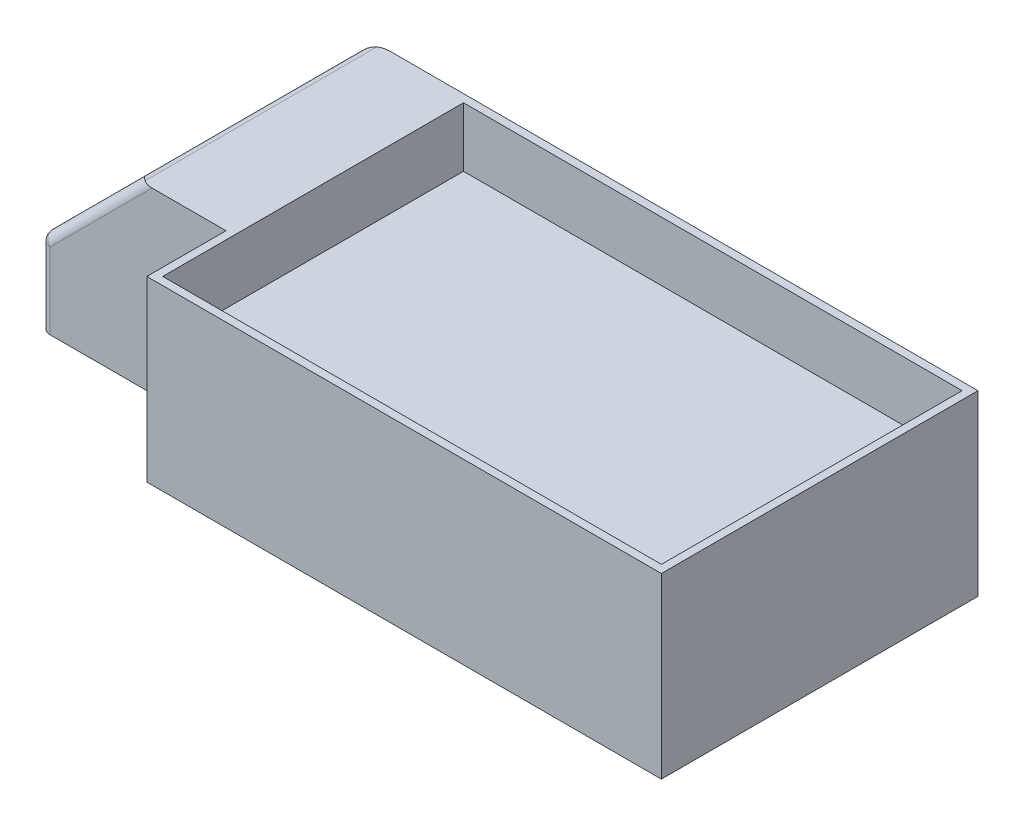
ISO-10303-21;
HEADER;
FILE_DESCRIPTION(('STEP AP214'),'2;1');
FILE_NAME('part.step','',(''),(''),'','','');
FILE_SCHEMA(('AUTOMOTIVE_DESIGN { 1 0 10303 214 1 1 1 1 }'));
ENDSEC;
DATA;
#1=APPLICATION_CONTEXT('core data for automotive mechanical design processes');
#2=APPLICATION_PROTOCOL_DEFINITION('international standard','automotive_design',2000,#1);
#3=PRODUCT_CONTEXT('',#1,'mechanical');
#4=PRODUCT('Part','Part','',(#3));
#5=PRODUCT_RELATED_PRODUCT_CATEGORY('part','',(#4));
#6=PRODUCT_DEFINITION_FORMATION('','',#4);
#7=PRODUCT_DEFINITION_CONTEXT('part definition',#1,'design');
#8=PRODUCT_DEFINITION('design','',#6,#7);
#9=PRODUCT_DEFINITION_SHAPE('','',#8);
#10=(LENGTH_UNIT() NAMED_UNIT(*) SI_UNIT(.MILLI.,.METRE.));
#11=(NAMED_UNIT(*) PLANE_ANGLE_UNIT() SI_UNIT($,.RADIAN.));
#12=(NAMED_UNIT(*) SI_UNIT($,.STERADIAN.) SOLID_ANGLE_UNIT());
#13=UNCERTAINTY_MEASURE_WITH_UNIT(LENGTH_MEASURE(1.E-05),#10,'distance_accuracy_value','');
#14=(GEOMETRIC_REPRESENTATION_CONTEXT(3) GLOBAL_UNCERTAINTY_ASSIGNED_CONTEXT((#13)) GLOBAL_UNIT_ASSIGNED_CONTEXT((#10,
#11,#12)) REPRESENTATION_CONTEXT('',''));
#15=CARTESIAN_POINT('',(0.,0.,0.));
#16=DIRECTION('',(0.,0.,1.));
#17=DIRECTION('',(1.,0.,0.));
#18=AXIS2_PLACEMENT_3D('',#15,#16,#17);
#19=CARTESIAN_POINT('',(0.,45.,0.));
#20=DIRECTION('',(0.,-1.,0.));
#21=DIRECTION('',(0.,0.,-1.));
#22=AXIS2_PLACEMENT_3D('',#19,#20,#21);
#23=PLANE('',#22);
#24=DIRECTION('',(0.,0.,-1.));
#25=VECTOR('',#24,1.);
#26=CARTESIAN_POINT('',(130.,45.,0.));
#27=LINE('',#26,#25);
#28=CARTESIAN_POINT('',(130.,45.,0.));
#29=VERTEX_POINT('',#28);
#30=CARTESIAN_POINT('',(130.,45.,-80.));
#31=VERTEX_POINT('',#30);
#32=EDGE_CURVE('E433',#29,#31,#27,.T.);
#33=ORIENTED_EDGE('',*,*,#32,.T.);
#34=DIRECTION('',(1.,0.,0.));
#35=VECTOR('',#34,1.);
#36=CARTESIAN_POINT('',(0.,45.,-80.));
#37=LINE('',#36,#35);
#38=CARTESIAN_POINT('',(-18.6671491507452,45.,-80.));
#39=VERTEX_POINT('',#38);
#40=EDGE_CURVE('E430',#39,#31,#37,.T.);
#41=ORIENTED_EDGE('',*,*,#40,.F.);
#42=CARTESIAN_POINT('',(-18.6671491507452,45.,-77.5));
#43=DIRECTION('',(0.,-1.,0.));
#44=DIRECTION('',(-1.,0.,0.));
#45=AXIS2_PLACEMENT_3D('',#42,#43,#44);
#46=ELLIPSE('',#45,3.53553390593274,2.5);
#47=CARTESIAN_POINT('',(-21.1671491507452,45.,-79.2677669529664));
#48=VERTEX_POINT('',#47);
#49=EDGE_CURVE('E492',#39,#48,#46,.F.);
#50=ORIENTED_EDGE('',*,*,#49,.T.);
#51=DIRECTION('',(0.,0.,1.));
#52=VECTOR('',#51,1.);
#53=CARTESIAN_POINT('',(-21.1671491507452,45.,0.));
#54=LINE('',#53,#52);
#55=CARTESIAN_POINT('',(-21.1671491507452,45.,-20.7322330470336));
#56=VERTEX_POINT('',#55);
#57=EDGE_CURVE('E489',#48,#56,#54,.T.);
#58=ORIENTED_EDGE('',*,*,#57,.T.);
#59=CARTESIAN_POINT('',(-18.6671491507452,45.,-22.5));
#60=DIRECTION('',(0.,-1.,0.));
#61=DIRECTION('',(1.,0.,0.));
#62=AXIS2_PLACEMENT_3D('',#59,#60,#61);
#63=ELLIPSE('',#62,3.53553390593274,2.5);
#64=CARTESIAN_POINT('',(-18.6671491507452,45.,-20.));
#65=VERTEX_POINT('',#64);
#66=EDGE_CURVE('E486',#56,#65,#63,.F.);
#67=ORIENTED_EDGE('',*,*,#66,.T.);
#68=DIRECTION('',(-1.,0.,0.));
#69=VECTOR('',#68,1.);
#70=CARTESIAN_POINT('',(-22.2026830566779,45.,-20.));
#71=LINE('',#70,#69);
#72=CARTESIAN_POINT('',(0.,45.,-20.));
#73=VERTEX_POINT('',#72);
#74=EDGE_CURVE('E411',#73,#65,#71,.T.);
#75=ORIENTED_EDGE('',*,*,#74,.F.);
#76=DIRECTION('',(0.,0.,1.));
#77=VECTOR('',#76,1.);
#78=CARTESIAN_POINT('',(0.,45.,-20.));
#79=LINE('',#78,#77);
#80=CARTESIAN_POINT('',(0.,45.,0.));
#81=VERTEX_POINT('',#80);
#82=EDGE_CURVE('E419',#73,#81,#79,.T.);
#83=ORIENTED_EDGE('',*,*,#82,.T.);
#84=DIRECTION('',(1.,0.,0.));
#85=VECTOR('',#84,1.);
#86=CARTESIAN_POINT('',(0.,45.,0.));
#87=LINE('',#86,#85);
#88=EDGE_CURVE('E438',#81,#29,#87,.T.);
#89=ORIENTED_EDGE('',*,*,#88,.T.);
#90=EDGE_LOOP('',(#33,#41,#50,#58,#67,#75,#83,#89));
#91=FACE_BOUND('',#90,.T.);
#92=DIRECTION('',(-1.,0.,0.));
#93=VECTOR('',#92,1.);
#94=CARTESIAN_POINT('',(0.,45.,-2.));
#95=LINE('',#94,#93);
#96=CARTESIAN_POINT('',(128.,45.,-2.));
#97=VERTEX_POINT('',#96);
#98=CARTESIAN_POINT('',(2.,45.,-2.));
#99=VERTEX_POINT('',#98);
#100=EDGE_CURVE('E263',#97,#99,#95,.T.);
#101=ORIENTED_EDGE('',*,*,#100,.T.);
#102=DIRECTION('',(0.,0.,-1.));
#103=VECTOR('',#102,1.);
#104=CARTESIAN_POINT('',(2.,45.,0.));
#105=LINE('',#104,#103);
#106=CARTESIAN_POINT('',(2.,45.,-78.));
#107=VERTEX_POINT('',#106);
#108=EDGE_CURVE('E273',#99,#107,#105,.T.);
#109=ORIENTED_EDGE('',*,*,#108,.T.);
#110=DIRECTION('',(-1.,0.,0.));
#111=VECTOR('',#110,1.);
#112=CARTESIAN_POINT('',(0.,45.,-78.));
#113=LINE('',#112,#111);
#114=CARTESIAN_POINT('',(128.,45.,-78.));
#115=VERTEX_POINT('',#114);
#116=EDGE_CURVE('E292',#115,#107,#113,.T.);
#117=ORIENTED_EDGE('',*,*,#116,.F.);
#118=DIRECTION('',(0.,0.,-1.));
#119=VECTOR('',#118,1.);
#120=CARTESIAN_POINT('',(128.,45.,0.));
#121=LINE('',#120,#119);
#122=EDGE_CURVE('E288',#97,#115,#121,.T.);
#123=ORIENTED_EDGE('',*,*,#122,.F.);
#124=EDGE_LOOP('',(#101,#109,#117,#123));
#125=FACE_BOUND('',#124,.T.);
#126=ADVANCED_FACE('F41',(#91,#125),#23,.F.);
#127=CARTESIAN_POINT('',(0.,45.,-76.));
#128=DIRECTION('',(0.,0.,-1.));
#129=DIRECTION('',(-1.,0.,0.));
#130=AXIS2_PLACEMENT_3D('',#127,#128,#129);
#131=PLANE('',#130);
#132=DIRECTION('',(0.,-1.,0.));
#133=VECTOR('',#132,1.);
#134=CARTESIAN_POINT('',(0.,45.,-76.));
#135=LINE('',#134,#133);
#136=CARTESIAN_POINT('',(0.,41.,-76.));
#137=VERTEX_POINT('',#136);
#138=CARTESIAN_POINT('',(0.,25.,-76.));
#139=VERTEX_POINT('',#138);
#140=EDGE_CURVE('E333',#137,#139,#135,.T.);
#141=ORIENTED_EDGE('',*,*,#140,.F.);
#142=DIRECTION('',(1.,0.,0.));
#143=VECTOR('',#142,1.);
#144=CARTESIAN_POINT('',(0.,41.,-76.));
#145=LINE('',#144,#143);
#146=CARTESIAN_POINT('',(-20.5458288071855,41.,-76.));
#147=VERTEX_POINT('',#146);
#148=EDGE_CURVE('E361',#147,#137,#145,.T.);
#149=ORIENTED_EDGE('',*,*,#148,.F.);
#150=DIRECTION('',(0.707106781186547,0.707106781186548,0.));
#151=VECTOR('',#150,1.);
#152=CARTESIAN_POINT('',(-44.1229932734609,17.4228355337246,-76.));
#153=LINE('',#152,#151);
#154=CARTESIAN_POINT('',(-42.9514203982071,18.5944084089784,-76.));
#155=VERTEX_POINT('',#154);
#156=EDGE_CURVE('E337',#155,#147,#153,.T.);
#157=ORIENTED_EDGE('',*,*,#156,.F.);
#158=DIRECTION('',(0.,-1.,0.));
#159=VECTOR('',#158,1.);
#160=CARTESIAN_POINT('',(-42.9514203982071,20.2512626584708,-76.));
#161=LINE('',#160,#159);
#162=CARTESIAN_POINT('',(-42.9514203982071,0.,-76.));
#163=VERTEX_POINT('',#162);
#164=EDGE_CURVE('E346',#155,#163,#161,.T.);
#165=ORIENTED_EDGE('',*,*,#164,.T.);
#166=DIRECTION('',(1.,0.,0.));
#167=VECTOR('',#166,1.);
#168=CARTESIAN_POINT('',(0.,0.,-76.));
#169=LINE('',#168,#167);
#170=CARTESIAN_POINT('',(126.,0.,-76.));
#171=VERTEX_POINT('',#170);
#172=EDGE_CURVE('E387',#163,#171,#169,.T.);
#173=ORIENTED_EDGE('',*,*,#172,.T.);
#174=DIRECTION('',(0.,-1.,0.));
#175=VECTOR('',#174,1.);
#176=CARTESIAN_POINT('',(126.,45.,-76.));
#177=LINE('',#176,#175);
#178=CARTESIAN_POINT('',(126.,25.,-76.));
#179=VERTEX_POINT('',#178);
#180=EDGE_CURVE('E365',#179,#171,#177,.T.);
#181=ORIENTED_EDGE('',*,*,#180,.F.);
#182=DIRECTION('',(-1.,0.,0.));
#183=VECTOR('',#182,1.);
#184=CARTESIAN_POINT('',(0.,25.,-76.));
#185=LINE('',#184,#183);
#186=EDGE_CURVE('E325',#179,#139,#185,.T.);
#187=ORIENTED_EDGE('',*,*,#186,.T.);
#188=EDGE_LOOP('',(#141,#149,#157,#165,#173,#181,#187));
#189=FACE_BOUND('',#188,.T.);
#190=ADVANCED_FACE('F570',(#189),#131,.F.);
#191=CARTESIAN_POINT('',(0.,41.,0.));
#192=DIRECTION('',(0.,-1.,0.));
#193=DIRECTION('',(0.,0.,-1.));
#194=AXIS2_PLACEMENT_3D('',#191,#192,#193);
#195=PLANE('',#194);
#196=ORIENTED_EDGE('',*,*,#148,.T.);
#197=DIRECTION('',(0.,0.,1.));
#198=VECTOR('',#197,1.);
#199=CARTESIAN_POINT('',(0.,41.,0.));
#200=LINE('',#199,#198);
#201=CARTESIAN_POINT('',(0.,41.,-24.));
#202=VERTEX_POINT('',#201);
#203=EDGE_CURVE('E329',#137,#202,#200,.T.);
#204=ORIENTED_EDGE('',*,*,#203,.T.);
#205=DIRECTION('',(-1.,0.,0.));
#206=VECTOR('',#205,1.);
#207=CARTESIAN_POINT('',(0.,41.,-24.));
#208=LINE('',#207,#206);
#209=CARTESIAN_POINT('',(-20.5458288071855,41.,-24.));
#210=VERTEX_POINT('',#209);
#211=EDGE_CURVE('E375',#202,#210,#208,.T.);
#212=ORIENTED_EDGE('',*,*,#211,.T.);
#213=DIRECTION('',(0.,0.,1.));
#214=VECTOR('',#213,1.);
#215=CARTESIAN_POINT('',(-20.5458288071855,41.,0.));
#216=LINE('',#215,#214);
#217=EDGE_CURVE('E341',#147,#210,#216,.T.);
#218=ORIENTED_EDGE('',*,*,#217,.F.);
#219=EDGE_LOOP('',(#196,#204,#212,#218));
#220=FACE_BOUND('',#219,.T.);
#221=ADVANCED_FACE('F576',(#220),#195,.T.);
#222=CARTESIAN_POINT('',(0.,0.,-24.));
#223=DIRECTION('',(0.,0.,1.));
#224=DIRECTION('',(1.,0.,0.));
#225=AXIS2_PLACEMENT_3D('',#222,#223,#224);
#226=PLANE('',#225);
#227=DIRECTION('',(0.,1.,0.));
#228=VECTOR('',#227,1.);
#229=CARTESIAN_POINT('',(0.,0.,-24.));
#230=LINE('',#229,#228);
#231=CARTESIAN_POINT('',(0.,25.,-24.));
#232=VERTEX_POINT('',#231);
#233=EDGE_CURVE('E539',#232,#202,#230,.T.);
#234=ORIENTED_EDGE('',*,*,#233,.F.);
#235=DIRECTION('',(1.,0.,0.));
#236=VECTOR('',#235,1.);
#237=CARTESIAN_POINT('',(0.,25.,-24.));
#238=LINE('',#237,#236);
#239=CARTESIAN_POINT('',(4.,25.,-24.));
#240=VERTEX_POINT('',#239);
#241=EDGE_CURVE('E507',#232,#240,#238,.T.);
#242=ORIENTED_EDGE('',*,*,#241,.T.);
#243=DIRECTION('',(0.,1.,0.));
#244=VECTOR('',#243,1.);
#245=CARTESIAN_POINT('',(4.,0.,-24.));
#246=LINE('',#245,#244);
#247=CARTESIAN_POINT('',(4.,0.,-24.));
#248=VERTEX_POINT('',#247);
#249=EDGE_CURVE('E379',#248,#240,#246,.T.);
#250=ORIENTED_EDGE('',*,*,#249,.F.);
#251=DIRECTION('',(1.,0.,0.));
#252=VECTOR('',#251,1.);
#253=CARTESIAN_POINT('',(0.,0.,-24.));
#254=LINE('',#253,#252);
#255=CARTESIAN_POINT('',(-42.9514203982071,0.,-24.));
#256=VERTEX_POINT('',#255);
#257=EDGE_CURVE('E374',#256,#248,#254,.T.);
#258=ORIENTED_EDGE('',*,*,#257,.F.);
#259=DIRECTION('',(0.,-1.,0.));
#260=VECTOR('',#259,1.);
#261=CARTESIAN_POINT('',(-42.9514203982071,0.,-24.));
#262=LINE('',#261,#260);
#263=CARTESIAN_POINT('',(-42.9514203982071,18.5944084089784,-24.));
#264=VERTEX_POINT('',#263);
#265=EDGE_CURVE('E355',#264,#256,#262,.T.);
#266=ORIENTED_EDGE('',*,*,#265,.F.);
#267=DIRECTION('',(0.707106781186547,0.707106781186548,0.));
#268=VECTOR('',#267,1.);
#269=CARTESIAN_POINT('',(-30.7729144035928,30.7729144035927,-24.));
#270=LINE('',#269,#268);
#271=EDGE_CURVE('E347',#264,#210,#270,.T.);
#272=ORIENTED_EDGE('',*,*,#271,.T.);
#273=ORIENTED_EDGE('',*,*,#211,.F.);
#274=EDGE_LOOP('',(#234,#242,#250,#258,#266,#272,#273));
#275=FACE_BOUND('',#274,.T.);
#276=ADVANCED_FACE('F586',(#275),#226,.F.);
#277=CARTESIAN_POINT('',(0.,0.,0.));
#278=DIRECTION('',(0.,-1.,0.));
#279=DIRECTION('',(0.,0.,-1.));
#280=AXIS2_PLACEMENT_3D('',#277,#278,#279);
#281=PLANE('',#280);
#282=DIRECTION('',(1.,0.,0.));
#283=VECTOR('',#282,1.);
#284=CARTESIAN_POINT('',(-46.9514203982071,0.,-20.));
#285=LINE('',#284,#283);
#286=CARTESIAN_POINT('',(-44.4514203982071,0.,-20.));
#287=VERTEX_POINT('',#286);
#288=CARTESIAN_POINT('',(0.,0.,-20.));
#289=VERTEX_POINT('',#288);
#290=EDGE_CURVE('E404',#287,#289,#285,.T.);
#291=ORIENTED_EDGE('',*,*,#290,.F.);
#292=CARTESIAN_POINT('',(-44.4514203982071,0.,-22.5));
#293=DIRECTION('',(0.,-1.,0.));
#294=DIRECTION('',(0.,0.,-1.));
#295=AXIS2_PLACEMENT_3D('',#292,#293,#294);
#296=CIRCLE('',#295,2.5);
#297=CARTESIAN_POINT('',(-46.9514203982071,0.,-22.5));
#298=VERTEX_POINT('',#297);
#299=EDGE_CURVE('E504',#287,#298,#296,.T.);
#300=ORIENTED_EDGE('',*,*,#299,.T.);
#301=DIRECTION('',(0.,0.,1.));
#302=VECTOR('',#301,1.);
#303=CARTESIAN_POINT('',(-46.9514203982071,0.,-145.034113182307));
#304=LINE('',#303,#302);
#305=CARTESIAN_POINT('',(-46.9514203982071,0.,-77.5));
#306=VERTEX_POINT('',#305);
#307=EDGE_CURVE('E423',#306,#298,#304,.T.);
#308=ORIENTED_EDGE('',*,*,#307,.F.);
#309=CARTESIAN_POINT('',(-44.4514203982071,0.,-77.5));
#310=DIRECTION('',(0.,-1.,0.));
#311=DIRECTION('',(0.,0.,-1.));
#312=AXIS2_PLACEMENT_3D('',#309,#310,#311);
#313=CIRCLE('',#312,2.5);
#314=CARTESIAN_POINT('',(-44.4514203982071,0.,-80.));
#315=VERTEX_POINT('',#314);
#316=EDGE_CURVE('E501',#306,#315,#313,.T.);
#317=ORIENTED_EDGE('',*,*,#316,.T.);
#318=DIRECTION('',(1.,0.,0.));
#319=VECTOR('',#318,1.);
#320=CARTESIAN_POINT('',(0.,0.,-80.));
#321=LINE('',#320,#319);
#322=CARTESIAN_POINT('',(130.,0.,-80.));
#323=VERTEX_POINT('',#322);
#324=EDGE_CURVE('E429',#315,#323,#321,.T.);
#325=ORIENTED_EDGE('',*,*,#324,.T.);
#326=DIRECTION('',(0.,0.,-1.));
#327=VECTOR('',#326,1.);
#328=CARTESIAN_POINT('',(130.,0.,0.));
#329=LINE('',#328,#327);
#330=CARTESIAN_POINT('',(130.,0.,0.));
#331=VERTEX_POINT('',#330);
#332=EDGE_CURVE('E445',#331,#323,#329,.T.);
#333=ORIENTED_EDGE('',*,*,#332,.F.);
#334=DIRECTION('',(1.,0.,0.));
#335=VECTOR('',#334,1.);
#336=CARTESIAN_POINT('',(0.,0.,0.));
#337=LINE('',#336,#335);
#338=CARTESIAN_POINT('',(0.,0.,0.));
#339=VERTEX_POINT('',#338);
#340=EDGE_CURVE('E434',#339,#331,#337,.T.);
#341=ORIENTED_EDGE('',*,*,#340,.F.);
#342=DIRECTION('',(0.,0.,1.));
#343=VECTOR('',#342,1.);
#344=CARTESIAN_POINT('',(0.,0.,-20.));
#345=LINE('',#344,#343);
#346=EDGE_CURVE('E415',#289,#339,#345,.T.);
#347=ORIENTED_EDGE('',*,*,#346,.F.);
#348=EDGE_LOOP('',(#291,#300,#308,#317,#325,#333,#341,#347));
#349=FACE_BOUND('',#348,.T.);
#350=DIRECTION('',(0.,0.,1.));
#351=VECTOR('',#350,1.);
#352=CARTESIAN_POINT('',(-42.9514203982071,0.,-145.034113182307));
#353=LINE('',#352,#351);
#354=EDGE_CURVE('E383',#163,#256,#353,.T.);
#355=ORIENTED_EDGE('',*,*,#354,.T.);
#356=ORIENTED_EDGE('',*,*,#257,.T.);
#357=DIRECTION('',(0.,0.,1.));
#358=VECTOR('',#357,1.);
#359=CARTESIAN_POINT('',(4.,0.,0.));
#360=LINE('',#359,#358);
#361=CARTESIAN_POINT('',(4.,0.,-4.));
#362=VERTEX_POINT('',#361);
#363=EDGE_CURVE('E378',#248,#362,#360,.T.);
#364=ORIENTED_EDGE('',*,*,#363,.T.);
#365=DIRECTION('',(1.,0.,0.));
#366=VECTOR('',#365,1.);
#367=CARTESIAN_POINT('',(0.,0.,-4.));
#368=LINE('',#367,#366);
#369=CARTESIAN_POINT('',(126.,0.,-4.));
#370=VERTEX_POINT('',#369);
#371=EDGE_CURVE('E366',#362,#370,#368,.T.);
#372=ORIENTED_EDGE('',*,*,#371,.T.);
#373=DIRECTION('',(0.,0.,-1.));
#374=VECTOR('',#373,1.);
#375=CARTESIAN_POINT('',(126.,0.,0.));
#376=LINE('',#375,#374);
#377=EDGE_CURVE('E391',#370,#171,#376,.T.);
#378=ORIENTED_EDGE('',*,*,#377,.T.);
#379=ORIENTED_EDGE('',*,*,#172,.F.);
#380=EDGE_LOOP('',(#355,#356,#364,#372,#378,#379));
#381=FACE_BOUND('',#380,.T.);
#382=ADVANCED_FACE('F583',(#349,#381),#281,.T.);
#383=CARTESIAN_POINT('',(-46.9514203982071,20.2512626584708,-145.034113182307));
#384=DIRECTION('',(0.707106781186548,-0.707106781186547,0.));
#385=DIRECTION('',(0.707106781186547,0.707106781186548,0.));
#386=AXIS2_PLACEMENT_3D('',#383,#384,#385);
#387=PLANE('',#386);
#388=DIRECTION('',(0.,0.,1.));
#389=VECTOR('',#388,1.);
#390=CARTESIAN_POINT('',(-39.8803525863416,27.3223304703363,-62.5));
#391=LINE('',#390,#389);
#392=CARTESIAN_POINT('',(-39.8803525863416,27.3223304703363,-62.5));
#393=VERTEX_POINT('',#392);
#394=CARTESIAN_POINT('',(-39.8803525863416,27.3223304703363,-37.5));
#395=VERTEX_POINT('',#394);
#396=EDGE_CURVE('E245',#393,#395,#391,.T.);
#397=ORIENTED_EDGE('',*,*,#396,.F.);
#398=DIRECTION('',(-0.707106781186547,-0.707106781186548,0.));
#399=VECTOR('',#398,1.);
#400=CARTESIAN_POINT('',(-29.2737508685434,37.9289321881345,-62.5));
#401=LINE('',#400,#399);
#402=CARTESIAN_POINT('',(-29.2737508685434,37.9289321881345,-62.5));
#403=VERTEX_POINT('',#402);
#404=EDGE_CURVE('E57',#403,#393,#401,.T.);
#405=ORIENTED_EDGE('',*,*,#404,.F.);
#406=DIRECTION('',(0.,0.,-1.));
#407=VECTOR('',#406,1.);
#408=CARTESIAN_POINT('',(-29.2737508685434,37.9289321881345,-62.5));
#409=LINE('',#408,#407);
#410=CARTESIAN_POINT('',(-29.2737508685434,37.9289321881345,-37.5));
#411=VERTEX_POINT('',#410);
#412=EDGE_CURVE('E253',#411,#403,#409,.T.);
#413=ORIENTED_EDGE('',*,*,#412,.F.);
#414=DIRECTION('',(0.707106781186547,0.707106781186548,0.));
#415=VECTOR('',#414,1.);
#416=CARTESIAN_POINT('',(-29.2737508685434,37.9289321881345,-37.5));
#417=LINE('',#416,#415);
#418=EDGE_CURVE('E235',#395,#411,#417,.T.);
#419=ORIENTED_EDGE('',*,*,#418,.F.);
#420=EDGE_LOOP('',(#397,#405,#413,#419));
#421=FACE_BOUND('',#420,.T.);
#422=DIRECTION('',(0.707106781186547,0.707106781186548,0.));
#423=VECTOR('',#422,1.);
#424=CARTESIAN_POINT('',(-46.9514203982071,20.2512626584708,-77.5));
#425=LINE('',#424,#423);
#426=CARTESIAN_POINT('',(-22.9349161037115,44.2677669529664,-77.5));
#427=VERTEX_POINT('',#426);
#428=CARTESIAN_POINT('',(-46.2191873511735,20.9834957055044,-77.5));
#429=VERTEX_POINT('',#428);
#430=EDGE_CURVE('E463',#427,#429,#425,.F.);
#431=ORIENTED_EDGE('',*,*,#430,.T.);
#432=DIRECTION('',(0.,0.,1.));
#433=VECTOR('',#432,1.);
#434=CARTESIAN_POINT('',(-46.2191873511735,20.9834957055044,-20.));
#435=LINE('',#434,#433);
#436=CARTESIAN_POINT('',(-46.2191873511735,20.9834957055044,-22.5));
#437=VERTEX_POINT('',#436);
#438=EDGE_CURVE('E466',#429,#437,#435,.T.);
#439=ORIENTED_EDGE('',*,*,#438,.T.);
#440=DIRECTION('',(-0.707106781186547,-0.707106781186548,0.));
#441=VECTOR('',#440,1.);
#442=CARTESIAN_POINT('',(-22.2026830566779,45.,-22.5));
#443=LINE('',#442,#441);
#444=CARTESIAN_POINT('',(-22.9349161037115,44.2677669529664,-22.5));
#445=VERTEX_POINT('',#444);
#446=EDGE_CURVE('E455',#437,#445,#443,.F.);
#447=ORIENTED_EDGE('',*,*,#446,.T.);
#448=DIRECTION('',(0.,0.,1.));
#449=VECTOR('',#448,1.);
#450=CARTESIAN_POINT('',(-22.9349161037115,44.2677669529664,-145.034113182307));
#451=LINE('',#450,#449);
#452=EDGE_CURVE('E460',#445,#427,#451,.F.);
#453=ORIENTED_EDGE('',*,*,#452,.T.);
#454=EDGE_LOOP('',(#431,#439,#447,#453));
#455=FACE_BOUND('',#454,.T.);
#456=ADVANCED_FACE('F250',(#421,#455),#387,.F.);
#457=CARTESIAN_POINT('',(-46.9514203982071,20.2512626584708,-145.034113182307));
#458=DIRECTION('',(-1.,0.,0.));
#459=DIRECTION('',(0.,-1.,0.));
#460=AXIS2_PLACEMENT_3D('',#457,#458,#459);
#461=PLANE('',#460);
#462=ORIENTED_EDGE('',*,*,#307,.T.);
#463=DIRECTION('',(0.,-1.,0.));
#464=VECTOR('',#463,1.);
#465=CARTESIAN_POINT('',(-46.9514203982071,20.2512626584708,-22.5));
#466=LINE('',#465,#464);
#467=CARTESIAN_POINT('',(-46.9514203982071,19.2157287525381,-22.5));
#468=VERTEX_POINT('',#467);
#469=EDGE_CURVE('E477',#298,#468,#466,.F.);
#470=ORIENTED_EDGE('',*,*,#469,.T.);
#471=DIRECTION('',(0.,0.,1.));
#472=VECTOR('',#471,1.);
#473=CARTESIAN_POINT('',(-46.9514203982071,19.2157287525381,-80.));
#474=LINE('',#473,#472);
#475=CARTESIAN_POINT('',(-46.9514203982071,19.2157287525381,-77.5));
#476=VERTEX_POINT('',#475);
#477=EDGE_CURVE('E473',#468,#476,#474,.F.);
#478=ORIENTED_EDGE('',*,*,#477,.T.);
#479=DIRECTION('',(0.,-1.,0.));
#480=VECTOR('',#479,1.);
#481=CARTESIAN_POINT('',(-46.9514203982071,20.2512626584708,-77.5));
#482=LINE('',#481,#480);
#483=EDGE_CURVE('E470',#476,#306,#482,.T.);
#484=ORIENTED_EDGE('',*,*,#483,.T.);
#485=EDGE_LOOP('',(#462,#470,#478,#484));
#486=FACE_BOUND('',#485,.T.);
#487=ADVANCED_FACE('F592',(#486),#461,.T.);
#488=CARTESIAN_POINT('',(0.,45.,0.));
#489=DIRECTION('',(0.,0.,-1.));
#490=DIRECTION('',(-1.,0.,0.));
#491=AXIS2_PLACEMENT_3D('',#488,#489,#490);
#492=PLANE('',#491);
#493=ORIENTED_EDGE('',*,*,#340,.T.);
#494=DIRECTION('',(0.,-1.,0.));
#495=VECTOR('',#494,1.);
#496=CARTESIAN_POINT('',(130.,45.,0.));
#497=LINE('',#496,#495);
#498=EDGE_CURVE('E452',#29,#331,#497,.T.);
#499=ORIENTED_EDGE('',*,*,#498,.F.);
#500=ORIENTED_EDGE('',*,*,#88,.F.);
#501=DIRECTION('',(0.,1.,0.));
#502=VECTOR('',#501,1.);
#503=CARTESIAN_POINT('',(0.,0.,0.));
#504=LINE('',#503,#502);
#505=EDGE_CURVE('E408',#339,#81,#504,.T.);
#506=ORIENTED_EDGE('',*,*,#505,.F.);
#507=EDGE_LOOP('',(#493,#499,#500,#506));
#508=FACE_BOUND('',#507,.T.);
#509=ADVANCED_FACE('F588',(#508),#492,.F.);
#510=CARTESIAN_POINT('',(130.,45.,0.));
#511=DIRECTION('',(-1.,0.,0.));
#512=DIRECTION('',(0.,0.,1.));
#513=AXIS2_PLACEMENT_3D('',#510,#511,#512);
#514=PLANE('',#513);
#515=ORIENTED_EDGE('',*,*,#332,.T.);
#516=DIRECTION('',(0.,-1.,0.));
#517=VECTOR('',#516,1.);
#518=CARTESIAN_POINT('',(130.,45.,-80.));
#519=LINE('',#518,#517);
#520=EDGE_CURVE('E441',#31,#323,#519,.T.);
#521=ORIENTED_EDGE('',*,*,#520,.F.);
#522=ORIENTED_EDGE('',*,*,#32,.F.);
#523=ORIENTED_EDGE('',*,*,#498,.T.);
#524=EDGE_LOOP('',(#515,#521,#522,#523));
#525=FACE_BOUND('',#524,.T.);
#526=ADVANCED_FACE('F591',(#525),#514,.F.);
#527=CARTESIAN_POINT('',(0.,45.,-80.));
#528=DIRECTION('',(0.,0.,-1.));
#529=DIRECTION('',(-1.,0.,0.));
#530=AXIS2_PLACEMENT_3D('',#527,#528,#529);
#531=PLANE('',#530);
#532=ORIENTED_EDGE('',*,*,#40,.T.);
#533=ORIENTED_EDGE('',*,*,#520,.T.);
#534=ORIENTED_EDGE('',*,*,#324,.F.);
#535=DIRECTION('',(0.,-1.,0.));
#536=VECTOR('',#535,1.);
#537=CARTESIAN_POINT('',(-44.4514203982071,45.,-80.));
#538=LINE('',#537,#536);
#539=CARTESIAN_POINT('',(-44.4514203982071,19.2157287525381,-80.));
#540=VERTEX_POINT('',#539);
#541=EDGE_CURVE('E480',#315,#540,#538,.F.);
#542=ORIENTED_EDGE('',*,*,#541,.T.);
#543=DIRECTION('',(0.707106781186547,0.707106781186548,0.));
#544=VECTOR('',#543,1.);
#545=CARTESIAN_POINT('',(-20.4349161037115,43.2322330470336,-80.));
#546=LINE('',#545,#544);
#547=EDGE_CURVE('E483',#540,#39,#546,.T.);
#548=ORIENTED_EDGE('',*,*,#547,.T.);
#549=EDGE_LOOP('',(#532,#533,#534,#542,#548));
#550=FACE_BOUND('',#549,.T.);
#551=ADVANCED_FACE('F596',(#550),#531,.T.);
#552=CARTESIAN_POINT('',(0.,0.,-20.));
#553=DIRECTION('',(1.,0.,0.));
#554=DIRECTION('',(0.,0.,-1.));
#555=AXIS2_PLACEMENT_3D('',#552,#553,#554);
#556=PLANE('',#555);
#557=ORIENTED_EDGE('',*,*,#505,.T.);
#558=ORIENTED_EDGE('',*,*,#82,.F.);
#559=DIRECTION('',(0.,1.,0.));
#560=VECTOR('',#559,1.);
#561=CARTESIAN_POINT('',(0.,0.,-20.));
#562=LINE('',#561,#560);
#563=EDGE_CURVE('E407',#289,#73,#562,.T.);
#564=ORIENTED_EDGE('',*,*,#563,.F.);
#565=ORIENTED_EDGE('',*,*,#346,.T.);
#566=EDGE_LOOP('',(#557,#558,#564,#565));
#567=FACE_BOUND('',#566,.T.);
#568=ADVANCED_FACE('F600',(#567),#556,.F.);
#569=CARTESIAN_POINT('',(0.,0.,-20.));
#570=DIRECTION('',(0.,0.,1.));
#571=DIRECTION('',(1.,0.,0.));
#572=AXIS2_PLACEMENT_3D('',#569,#570,#571);
#573=PLANE('',#572);
#574=ORIENTED_EDGE('',*,*,#74,.T.);
#575=DIRECTION('',(-0.707106781186547,-0.707106781186548,0.));
#576=VECTOR('',#575,1.);
#577=CARTESIAN_POINT('',(-45.1836534452407,18.4834957055044,-20.));
#578=LINE('',#577,#576);
#579=CARTESIAN_POINT('',(-44.4514203982071,19.2157287525381,-20.));
#580=VERTEX_POINT('',#579);
#581=EDGE_CURVE('E498',#65,#580,#578,.T.);
#582=ORIENTED_EDGE('',*,*,#581,.T.);
#583=DIRECTION('',(0.,-1.,0.));
#584=VECTOR('',#583,1.);
#585=CARTESIAN_POINT('',(-44.4514203982071,0.,-20.));
#586=LINE('',#585,#584);
#587=EDGE_CURVE('E495',#580,#287,#586,.T.);
#588=ORIENTED_EDGE('',*,*,#587,.T.);
#589=ORIENTED_EDGE('',*,*,#290,.T.);
#590=ORIENTED_EDGE('',*,*,#563,.T.);
#591=EDGE_LOOP('',(#574,#582,#588,#589,#590));
#592=FACE_BOUND('',#591,.T.);
#593=ADVANCED_FACE('F631',(#592),#573,.T.);
#594=CARTESIAN_POINT('',(-21.1671491507452,42.5,0.));
#595=DIRECTION('',(0.,0.,1.));
#596=DIRECTION('',(1.,0.,0.));
#597=AXIS2_PLACEMENT_3D('',#594,#595,#596);
#598=CYLINDRICAL_SURFACE('',#597,2.5);
#599=CARTESIAN_POINT('',(-21.1671491507452,42.5,-22.5));
#600=DIRECTION('',(0.5,0.5,-0.707106781186547));
#601=DIRECTION('',(0.5,0.5,0.707106781186547));
#602=AXIS2_PLACEMENT_3D('',#599,#600,#601);
#603=ELLIPSE('',#602,3.53553390593274,2.5);
#604=EDGE_CURVE('E529',#56,#445,#603,.F.);
#605=ORIENTED_EDGE('',*,*,#604,.F.);
#606=ORIENTED_EDGE('',*,*,#57,.F.);
#607=CARTESIAN_POINT('',(-21.1671491507452,42.5,-77.5));
#608=DIRECTION('',(0.5,0.5,0.707106781186548));
#609=DIRECTION('',(-0.5,-0.5,0.707106781186548));
#610=AXIS2_PLACEMENT_3D('',#607,#608,#609);
#611=ELLIPSE('',#610,3.53553390593274,2.5);
#612=EDGE_CURVE('E418',#427,#48,#611,.F.);
#613=ORIENTED_EDGE('',*,*,#612,.F.);
#614=ORIENTED_EDGE('',*,*,#452,.F.);
#615=EDGE_LOOP('',(#605,#606,#613,#614));
#616=FACE_BOUND('',#615,.T.);
#617=ADVANCED_FACE('F43',(#616),#598,.T.);
#618=CARTESIAN_POINT('',(-44.4514203982071,20.2512626584708,-77.5));
#619=DIRECTION('',(0.,-1.,0.));
#620=DIRECTION('',(1.,0.,0.));
#621=AXIS2_PLACEMENT_3D('',#618,#619,#620);
#622=CYLINDRICAL_SURFACE('',#621,2.5);
#623=ORIENTED_EDGE('',*,*,#316,.F.);
#624=ORIENTED_EDGE('',*,*,#483,.F.);
#625=CARTESIAN_POINT('',(-44.4514203982071,19.2157287525381,-77.5));
#626=DIRECTION('',(0.,1.,0.));
#627=DIRECTION('',(-1.,0.,0.));
#628=AXIS2_PLACEMENT_3D('',#625,#626,#627);
#629=CIRCLE('',#628,2.5);
#630=EDGE_CURVE('E525',#540,#476,#629,.T.);
#631=ORIENTED_EDGE('',*,*,#630,.F.);
#632=ORIENTED_EDGE('',*,*,#541,.F.);
#633=EDGE_LOOP('',(#623,#624,#631,#632));
#634=FACE_BOUND('',#633,.T.);
#635=ADVANCED_FACE('F624',(#634),#622,.T.);
#636=CARTESIAN_POINT('',(-9.33357457537259,54.3335745753726,-77.5));
#637=DIRECTION('',(-0.707106781186547,-0.707106781186548,0.));
#638=DIRECTION('',(0.707106781186548,-0.707106781186547,0.));
#639=AXIS2_PLACEMENT_3D('',#636,#637,#638);
#640=CYLINDRICAL_SURFACE('',#639,2.5);
#641=ORIENTED_EDGE('',*,*,#49,.F.);
#642=ORIENTED_EDGE('',*,*,#547,.F.);
#643=CARTESIAN_POINT('',(-44.4514203982071,19.2157287525381,-77.5));
#644=DIRECTION('',(-0.707106781186548,-0.707106781186548,0.));
#645=DIRECTION('',(0.707106781186548,-0.707106781186548,0.));
#646=AXIS2_PLACEMENT_3D('',#643,#644,#645);
#647=CIRCLE('',#646,2.5);
#648=EDGE_CURVE('E521',#429,#540,#647,.T.);
#649=ORIENTED_EDGE('',*,*,#648,.F.);
#650=ORIENTED_EDGE('',*,*,#430,.F.);
#651=ORIENTED_EDGE('',*,*,#612,.T.);
#652=EDGE_LOOP('',(#641,#642,#649,#650,#651));
#653=FACE_BOUND('',#652,.T.);
#654=ADVANCED_FACE('F621',(#653),#640,.T.);
#655=CARTESIAN_POINT('',(-31.8335745753726,31.8335745753726,-22.5));
#656=DIRECTION('',(0.707106781186547,0.707106781186548,0.));
#657=DIRECTION('',(-0.707106781186548,0.707106781186547,0.));
#658=AXIS2_PLACEMENT_3D('',#655,#656,#657);
#659=CYLINDRICAL_SURFACE('',#658,2.5);
#660=ORIENTED_EDGE('',*,*,#604,.T.);
#661=ORIENTED_EDGE('',*,*,#446,.F.);
#662=CARTESIAN_POINT('',(-44.4514203982071,19.2157287525381,-22.5));
#663=DIRECTION('',(-0.707106781186547,-0.707106781186547,0.));
#664=DIRECTION('',(0.707106781186547,-0.707106781186547,0.));
#665=AXIS2_PLACEMENT_3D('',#662,#663,#664);
#666=CIRCLE('',#665,2.5);
#667=EDGE_CURVE('E517',#580,#437,#666,.T.);
#668=ORIENTED_EDGE('',*,*,#667,.F.);
#669=ORIENTED_EDGE('',*,*,#581,.F.);
#670=ORIENTED_EDGE('',*,*,#66,.F.);
#671=EDGE_LOOP('',(#660,#661,#668,#669,#670));
#672=FACE_BOUND('',#671,.T.);
#673=ADVANCED_FACE('F617',(#672),#659,.T.);
#674=CARTESIAN_POINT('',(-44.4514203982071,0.,-22.5));
#675=DIRECTION('',(0.,-1.,0.));
#676=DIRECTION('',(1.,0.,0.));
#677=AXIS2_PLACEMENT_3D('',#674,#675,#676);
#678=CYLINDRICAL_SURFACE('',#677,2.5);
#679=ORIENTED_EDGE('',*,*,#299,.F.);
#680=ORIENTED_EDGE('',*,*,#587,.F.);
#681=CARTESIAN_POINT('',(-44.4514203982071,19.2157287525381,-22.5));
#682=DIRECTION('',(0.,1.,0.));
#683=DIRECTION('',(0.,0.,1.));
#684=AXIS2_PLACEMENT_3D('',#681,#682,#683);
#685=CIRCLE('',#684,2.5);
#686=EDGE_CURVE('E513',#468,#580,#685,.T.);
#687=ORIENTED_EDGE('',*,*,#686,.F.);
#688=ORIENTED_EDGE('',*,*,#469,.F.);
#689=EDGE_LOOP('',(#679,#680,#687,#688));
#690=FACE_BOUND('',#689,.T.);
#691=ADVANCED_FACE('F613',(#690),#678,.T.);
#692=CARTESIAN_POINT('',(-44.4514203982071,19.2157287525381,-77.5));
#693=DIRECTION('',(0.,0.,-1.));
#694=DIRECTION('',(0.,1.,0.));
#695=AXIS2_PLACEMENT_3D('',#692,#693,#694);
#696=SPHERICAL_SURFACE('',#695,2.5);
#697=ORIENTED_EDGE('',*,*,#648,.T.);
#698=ORIENTED_EDGE('',*,*,#630,.T.);
#699=CARTESIAN_POINT('',(-44.4514203982071,19.2157287525381,-77.5));
#700=DIRECTION('',(0.,0.,-1.));
#701=DIRECTION('',(-1.,0.,0.));
#702=AXIS2_PLACEMENT_3D('',#699,#700,#701);
#703=CIRCLE('',#702,2.5);
#704=EDGE_CURVE('E510',#429,#476,#703,.F.);
#705=ORIENTED_EDGE('',*,*,#704,.F.);
#706=EDGE_LOOP('',(#697,#698,#705));
#707=FACE_BOUND('',#706,.T.);
#708=ADVANCED_FACE('F609',(#707),#696,.T.);
#709=CARTESIAN_POINT('',(-44.4514203982071,19.2157287525381,-22.5));
#710=DIRECTION('',(0.,0.,1.));
#711=DIRECTION('',(1.,0.,0.));
#712=AXIS2_PLACEMENT_3D('',#709,#710,#711);
#713=SPHERICAL_SURFACE('',#712,2.5);
#714=ORIENTED_EDGE('',*,*,#686,.T.);
#715=ORIENTED_EDGE('',*,*,#667,.T.);
#716=CARTESIAN_POINT('',(-44.4514203982071,19.2157287525381,-22.5));
#717=DIRECTION('',(0.,0.,1.));
#718=DIRECTION('',(1.,0.,0.));
#719=AXIS2_PLACEMENT_3D('',#716,#717,#718);
#720=CIRCLE('',#719,2.5);
#721=EDGE_CURVE('E358',#468,#437,#720,.F.);
#722=ORIENTED_EDGE('',*,*,#721,.F.);
#723=EDGE_LOOP('',(#714,#715,#722));
#724=FACE_BOUND('',#723,.T.);
#725=ADVANCED_FACE('F605',(#724),#713,.T.);
#726=CARTESIAN_POINT('',(-44.4514203982071,19.2157287525381,-145.034113182307));
#727=DIRECTION('',(0.,0.,-1.));
#728=DIRECTION('',(-1.,0.,0.));
#729=AXIS2_PLACEMENT_3D('',#726,#727,#728);
#730=CYLINDRICAL_SURFACE('',#729,2.5);
#731=ORIENTED_EDGE('',*,*,#704,.T.);
#732=ORIENTED_EDGE('',*,*,#477,.F.);
#733=ORIENTED_EDGE('',*,*,#721,.T.);
#734=ORIENTED_EDGE('',*,*,#438,.F.);
#735=EDGE_LOOP('',(#731,#732,#733,#734));
#736=FACE_BOUND('',#735,.T.);
#737=ADVANCED_FACE('F602',(#736),#730,.T.);
#738=CARTESIAN_POINT('',(-44.1229932734609,17.4228355337246,-145.034113182307));
#739=DIRECTION('',(0.707106781186548,-0.707106781186547,0.));
#740=DIRECTION('',(0.707106781186547,0.707106781186548,0.));
#741=AXIS2_PLACEMENT_3D('',#738,#739,#740);
#742=PLANE('',#741);
#743=DIRECTION('',(0.707106781186547,0.707106781186548,0.));
#744=VECTOR('',#743,1.);
#745=CARTESIAN_POINT('',(-44.1229932734609,17.4228355337246,-62.5));
#746=LINE('',#745,#744);
#747=CARTESIAN_POINT('',(-37.0519254615954,24.4939033455901,-62.5));
#748=VERTEX_POINT('',#747);
#749=CARTESIAN_POINT('',(-26.4453237437972,35.1005050633883,-62.5));
#750=VERTEX_POINT('',#749);
#751=EDGE_CURVE('E11',#748,#750,#746,.T.);
#752=ORIENTED_EDGE('',*,*,#751,.F.);
#753=DIRECTION('',(0.,0.,-1.));
#754=VECTOR('',#753,1.);
#755=CARTESIAN_POINT('',(-37.0519254615954,24.4939033455901,-145.034113182307));
#756=LINE('',#755,#754);
#757=CARTESIAN_POINT('',(-37.0519254615954,24.4939033455901,-37.5));
#758=VERTEX_POINT('',#757);
#759=EDGE_CURVE('E542',#758,#748,#756,.T.);
#760=ORIENTED_EDGE('',*,*,#759,.F.);
#761=DIRECTION('',(-0.707106781186547,-0.707106781186548,0.));
#762=VECTOR('',#761,1.);
#763=CARTESIAN_POINT('',(-44.1229932734609,17.4228355337246,-37.5));
#764=LINE('',#763,#762);
#765=CARTESIAN_POINT('',(-26.4453237437972,35.1005050633883,-37.5));
#766=VERTEX_POINT('',#765);
#767=EDGE_CURVE('E238',#766,#758,#764,.T.);
#768=ORIENTED_EDGE('',*,*,#767,.F.);
#769=DIRECTION('',(0.,0.,1.));
#770=VECTOR('',#769,1.);
#771=CARTESIAN_POINT('',(-26.4453237437972,35.1005050633883,-145.034113182307));
#772=LINE('',#771,#770);
#773=EDGE_CURVE('E50',#750,#766,#772,.T.);
#774=ORIENTED_EDGE('',*,*,#773,.F.);
#775=EDGE_LOOP('',(#752,#760,#768,#774));
#776=FACE_BOUND('',#775,.T.);
#777=ORIENTED_EDGE('',*,*,#156,.T.);
#778=ORIENTED_EDGE('',*,*,#217,.T.);
#779=ORIENTED_EDGE('',*,*,#271,.F.);
#780=DIRECTION('',(0.,0.,-1.));
#781=VECTOR('',#780,1.);
#782=CARTESIAN_POINT('',(-42.9514203982071,18.5944084089784,-145.034113182307));
#783=LINE('',#782,#781);
#784=EDGE_CURVE('E342',#264,#155,#783,.T.);
#785=ORIENTED_EDGE('',*,*,#784,.T.);
#786=EDGE_LOOP('',(#777,#778,#779,#785));
#787=FACE_BOUND('',#786,.T.);
#788=ADVANCED_FACE('F553',(#776,#787),#742,.T.);
#789=CARTESIAN_POINT('',(-42.9514203982071,20.2512626584708,-145.034113182307));
#790=DIRECTION('',(-1.,0.,0.));
#791=DIRECTION('',(0.,-1.,0.));
#792=AXIS2_PLACEMENT_3D('',#789,#790,#791);
#793=PLANE('',#792);
#794=ORIENTED_EDGE('',*,*,#354,.F.);
#795=ORIENTED_EDGE('',*,*,#164,.F.);
#796=ORIENTED_EDGE('',*,*,#784,.F.);
#797=ORIENTED_EDGE('',*,*,#265,.T.);
#798=EDGE_LOOP('',(#794,#795,#796,#797));
#799=FACE_BOUND('',#798,.T.);
#800=ADVANCED_FACE('F696',(#799),#793,.F.);
#801=CARTESIAN_POINT('',(0.,45.,-4.));
#802=DIRECTION('',(0.,0.,-1.));
#803=DIRECTION('',(-1.,0.,0.));
#804=AXIS2_PLACEMENT_3D('',#801,#802,#803);
#805=PLANE('',#804);
#806=DIRECTION('',(-1.,0.,0.));
#807=VECTOR('',#806,1.);
#808=CARTESIAN_POINT('',(0.,25.,-4.));
#809=LINE('',#808,#807);
#810=CARTESIAN_POINT('',(126.,25.,-4.));
#811=VERTEX_POINT('',#810);
#812=CARTESIAN_POINT('',(4.,25.,-4.));
#813=VERTEX_POINT('',#812);
#814=EDGE_CURVE('E319',#811,#813,#809,.T.);
#815=ORIENTED_EDGE('',*,*,#814,.F.);
#816=DIRECTION('',(0.,-1.,0.));
#817=VECTOR('',#816,1.);
#818=CARTESIAN_POINT('',(126.,45.,-4.));
#819=LINE('',#818,#817);
#820=EDGE_CURVE('E351',#811,#370,#819,.T.);
#821=ORIENTED_EDGE('',*,*,#820,.T.);
#822=ORIENTED_EDGE('',*,*,#371,.F.);
#823=DIRECTION('',(0.,1.,0.));
#824=VECTOR('',#823,1.);
#825=CARTESIAN_POINT('',(4.,0.,-4.));
#826=LINE('',#825,#824);
#827=EDGE_CURVE('E336',#362,#813,#826,.T.);
#828=ORIENTED_EDGE('',*,*,#827,.T.);
#829=EDGE_LOOP('',(#815,#821,#822,#828));
#830=FACE_BOUND('',#829,.T.);
#831=ADVANCED_FACE('F692',(#830),#805,.T.);
#832=CARTESIAN_POINT('',(126.,45.,0.));
#833=DIRECTION('',(-1.,0.,0.));
#834=DIRECTION('',(0.,0.,1.));
#835=AXIS2_PLACEMENT_3D('',#832,#833,#834);
#836=PLANE('',#835);
#837=DIRECTION('',(0.,0.,1.));
#838=VECTOR('',#837,1.);
#839=CARTESIAN_POINT('',(126.,25.,0.));
#840=LINE('',#839,#838);
#841=EDGE_CURVE('E322',#179,#811,#840,.T.);
#842=ORIENTED_EDGE('',*,*,#841,.F.);
#843=ORIENTED_EDGE('',*,*,#180,.T.);
#844=ORIENTED_EDGE('',*,*,#377,.F.);
#845=ORIENTED_EDGE('',*,*,#820,.F.);
#846=EDGE_LOOP('',(#842,#843,#844,#845));
#847=FACE_BOUND('',#846,.T.);
#848=ADVANCED_FACE('F685',(#847),#836,.T.);
#849=CARTESIAN_POINT('',(4.,0.,-20.));
#850=DIRECTION('',(1.,0.,0.));
#851=DIRECTION('',(0.,0.,-1.));
#852=AXIS2_PLACEMENT_3D('',#849,#850,#851);
#853=PLANE('',#852);
#854=DIRECTION('',(0.,0.,-1.));
#855=VECTOR('',#854,1.);
#856=CARTESIAN_POINT('',(4.,25.,-20.));
#857=LINE('',#856,#855);
#858=EDGE_CURVE('E316',#813,#240,#857,.T.);
#859=ORIENTED_EDGE('',*,*,#858,.F.);
#860=ORIENTED_EDGE('',*,*,#827,.F.);
#861=ORIENTED_EDGE('',*,*,#363,.F.);
#862=ORIENTED_EDGE('',*,*,#249,.T.);
#863=EDGE_LOOP('',(#859,#860,#861,#862));
#864=FACE_BOUND('',#863,.T.);
#865=ADVANCED_FACE('F681',(#864),#853,.T.);
#866=CARTESIAN_POINT('',(0.,25.,0.));
#867=DIRECTION('',(1.,0.,0.));
#868=DIRECTION('',(0.,0.,-1.));
#869=AXIS2_PLACEMENT_3D('',#866,#867,#868);
#870=PLANE('',#869);
#871=ORIENTED_EDGE('',*,*,#203,.F.);
#872=ORIENTED_EDGE('',*,*,#140,.T.);
#873=DIRECTION('',(0.,0.,-1.));
#874=VECTOR('',#873,1.);
#875=CARTESIAN_POINT('',(0.,25.,0.));
#876=LINE('',#875,#874);
#877=EDGE_CURVE('E303',#232,#139,#876,.T.);
#878=ORIENTED_EDGE('',*,*,#877,.F.);
#879=ORIENTED_EDGE('',*,*,#233,.T.);
#880=EDGE_LOOP('',(#871,#872,#878,#879));
#881=FACE_BOUND('',#880,.T.);
#882=ADVANCED_FACE('F684',(#881),#870,.F.);
#883=CARTESIAN_POINT('',(0.,25.,0.));
#884=DIRECTION('',(0.,-1.,0.));
#885=DIRECTION('',(0.,0.,-1.));
#886=AXIS2_PLACEMENT_3D('',#883,#884,#885);
#887=PLANE('',#886);
#888=ORIENTED_EDGE('',*,*,#186,.F.);
#889=ORIENTED_EDGE('',*,*,#841,.T.);
#890=ORIENTED_EDGE('',*,*,#814,.T.);
#891=ORIENTED_EDGE('',*,*,#858,.T.);
#892=ORIENTED_EDGE('',*,*,#241,.F.);
#893=ORIENTED_EDGE('',*,*,#877,.T.);
#894=EDGE_LOOP('',(#888,#889,#890,#891,#892,#893));
#895=FACE_BOUND('',#894,.T.);
#896=ADVANCED_FACE('F705',(#895),#887,.T.);
#897=CARTESIAN_POINT('',(0.,30.,-2.));
#898=DIRECTION('',(0.,0.,-1.));
#899=DIRECTION('',(-1.,0.,0.));
#900=AXIS2_PLACEMENT_3D('',#897,#898,#899);
#901=PLANE('',#900);
#902=ORIENTED_EDGE('',*,*,#100,.F.);
#903=DIRECTION('',(0.,1.,0.));
#904=VECTOR('',#903,1.);
#905=CARTESIAN_POINT('',(128.,30.,-2.));
#906=LINE('',#905,#904);
#907=CARTESIAN_POINT('',(128.,30.,-2.));
#908=VERTEX_POINT('',#907);
#909=EDGE_CURVE('E284',#908,#97,#906,.T.);
#910=ORIENTED_EDGE('',*,*,#909,.F.);
#911=DIRECTION('',(-1.,0.,0.));
#912=VECTOR('',#911,1.);
#913=CARTESIAN_POINT('',(0.,30.,-2.));
#914=LINE('',#913,#912);
#915=CARTESIAN_POINT('',(2.,30.,-2.));
#916=VERTEX_POINT('',#915);
#917=EDGE_CURVE('E268',#908,#916,#914,.T.);
#918=ORIENTED_EDGE('',*,*,#917,.T.);
#919=DIRECTION('',(0.,1.,0.));
#920=VECTOR('',#919,1.);
#921=CARTESIAN_POINT('',(2.,30.,-2.));
#922=LINE('',#921,#920);
#923=EDGE_CURVE('E299',#916,#99,#922,.T.);
#924=ORIENTED_EDGE('',*,*,#923,.T.);
#925=EDGE_LOOP('',(#902,#910,#918,#924));
#926=FACE_BOUND('',#925,.T.);
#927=ADVANCED_FACE('F709',(#926),#901,.T.);
#928=CARTESIAN_POINT('',(2.,30.,0.));
#929=DIRECTION('',(1.,0.,0.));
#930=DIRECTION('',(0.,0.,-1.));
#931=AXIS2_PLACEMENT_3D('',#928,#929,#930);
#932=PLANE('',#931);
#933=ORIENTED_EDGE('',*,*,#108,.F.);
#934=ORIENTED_EDGE('',*,*,#923,.F.);
#935=DIRECTION('',(0.,0.,-1.));
#936=VECTOR('',#935,1.);
#937=CARTESIAN_POINT('',(2.,30.,0.));
#938=LINE('',#937,#936);
#939=CARTESIAN_POINT('',(2.,30.,-78.));
#940=VERTEX_POINT('',#939);
#941=EDGE_CURVE('E281',#916,#940,#938,.T.);
#942=ORIENTED_EDGE('',*,*,#941,.T.);
#943=DIRECTION('',(0.,1.,0.));
#944=VECTOR('',#943,1.);
#945=CARTESIAN_POINT('',(2.,30.,-78.));
#946=LINE('',#945,#944);
#947=EDGE_CURVE('E304',#940,#107,#946,.T.);
#948=ORIENTED_EDGE('',*,*,#947,.T.);
#949=EDGE_LOOP('',(#933,#934,#942,#948));
#950=FACE_BOUND('',#949,.T.);
#951=ADVANCED_FACE('F713',(#950),#932,.T.);
#952=CARTESIAN_POINT('',(0.,30.,-78.));
#953=DIRECTION('',(0.,0.,-1.));
#954=DIRECTION('',(-1.,0.,0.));
#955=AXIS2_PLACEMENT_3D('',#952,#953,#954);
#956=PLANE('',#955);
#957=ORIENTED_EDGE('',*,*,#116,.T.);
#958=ORIENTED_EDGE('',*,*,#947,.F.);
#959=DIRECTION('',(-1.,0.,0.));
#960=VECTOR('',#959,1.);
#961=CARTESIAN_POINT('',(0.,30.,-78.));
#962=LINE('',#961,#960);
#963=CARTESIAN_POINT('',(128.,30.,-78.));
#964=VERTEX_POINT('',#963);
#965=EDGE_CURVE('E277',#964,#940,#962,.T.);
#966=ORIENTED_EDGE('',*,*,#965,.F.);
#967=DIRECTION('',(0.,1.,0.));
#968=VECTOR('',#967,1.);
#969=CARTESIAN_POINT('',(128.,30.,-78.));
#970=LINE('',#969,#968);
#971=EDGE_CURVE('E307',#964,#115,#970,.T.);
#972=ORIENTED_EDGE('',*,*,#971,.T.);
#973=EDGE_LOOP('',(#957,#958,#966,#972));
#974=FACE_BOUND('',#973,.T.);
#975=ADVANCED_FACE('F717',(#974),#956,.F.);
#976=CARTESIAN_POINT('',(128.,30.,0.));
#977=DIRECTION('',(1.,0.,0.));
#978=DIRECTION('',(0.,0.,-1.));
#979=AXIS2_PLACEMENT_3D('',#976,#977,#978);
#980=PLANE('',#979);
#981=ORIENTED_EDGE('',*,*,#122,.T.);
#982=ORIENTED_EDGE('',*,*,#971,.F.);
#983=DIRECTION('',(0.,0.,-1.));
#984=VECTOR('',#983,1.);
#985=CARTESIAN_POINT('',(128.,30.,0.));
#986=LINE('',#985,#984);
#987=EDGE_CURVE('E272',#908,#964,#986,.T.);
#988=ORIENTED_EDGE('',*,*,#987,.F.);
#989=ORIENTED_EDGE('',*,*,#909,.T.);
#990=EDGE_LOOP('',(#981,#982,#988,#989));
#991=FACE_BOUND('',#990,.T.);
#992=ADVANCED_FACE('F565',(#991),#980,.F.);
#993=CARTESIAN_POINT('',(0.,30.,0.));
#994=DIRECTION('',(0.,1.,0.));
#995=DIRECTION('',(0.,0.,1.));
#996=AXIS2_PLACEMENT_3D('',#993,#994,#995);
#997=PLANE('',#996);
#998=ORIENTED_EDGE('',*,*,#917,.F.);
#999=ORIENTED_EDGE('',*,*,#987,.T.);
#1000=ORIENTED_EDGE('',*,*,#965,.T.);
#1001=ORIENTED_EDGE('',*,*,#941,.F.);
#1002=EDGE_LOOP('',(#998,#999,#1000,#1001));
#1003=FACE_BOUND('',#1002,.T.);
#1004=ADVANCED_FACE('F558',(#1003),#997,.T.);
#1005=CARTESIAN_POINT('',(-18.6671491507452,27.3223304703363,-62.5));
#1006=DIRECTION('',(0.,0.,-1.));
#1007=DIRECTION('',(-1.,0.,0.));
#1008=AXIS2_PLACEMENT_3D('',#1005,#1006,#1007);
#1009=PLANE('',#1008);
#1010=ORIENTED_EDGE('',*,*,#751,.T.);
#1011=DIRECTION('',(-0.707106781186548,0.707106781186547,0.));
#1012=VECTOR('',#1011,1.);
#1013=CARTESIAN_POINT('',(-18.6671491507452,27.3223304703363,-62.5));
#1014=LINE('',#1013,#1012);
#1015=EDGE_CURVE('E260',#750,#403,#1014,.T.);
#1016=ORIENTED_EDGE('',*,*,#1015,.T.);
#1017=ORIENTED_EDGE('',*,*,#404,.T.);
#1018=DIRECTION('',(-0.707106781186548,0.707106781186547,0.));
#1019=VECTOR('',#1018,1.);
#1020=CARTESIAN_POINT('',(-29.2737508685434,16.7157287525381,-62.5));
#1021=LINE('',#1020,#1019);
#1022=EDGE_CURVE('E242',#748,#393,#1021,.T.);
#1023=ORIENTED_EDGE('',*,*,#1022,.F.);
#1024=EDGE_LOOP('',(#1010,#1016,#1017,#1023));
#1025=FACE_BOUND('',#1024,.T.);
#1026=ADVANCED_FACE('F555',(#1025),#1009,.F.);
#1027=CARTESIAN_POINT('',(-18.6671491507452,27.3223304703363,-62.5));
#1028=DIRECTION('',(0.707106781186547,0.707106781186548,0.));
#1029=DIRECTION('',(-0.707106781186548,0.707106781186547,0.));
#1030=AXIS2_PLACEMENT_3D('',#1027,#1028,#1029);
#1031=PLANE('',#1030);
#1032=ORIENTED_EDGE('',*,*,#773,.T.);
#1033=DIRECTION('',(-0.707106781186548,0.707106781186547,0.));
#1034=VECTOR('',#1033,1.);
#1035=CARTESIAN_POINT('',(-18.6671491507452,27.3223304703363,-37.5));
#1036=LINE('',#1035,#1034);
#1037=EDGE_CURVE('E241',#766,#411,#1036,.T.);
#1038=ORIENTED_EDGE('',*,*,#1037,.T.);
#1039=ORIENTED_EDGE('',*,*,#412,.T.);
#1040=ORIENTED_EDGE('',*,*,#1015,.F.);
#1041=EDGE_LOOP('',(#1032,#1038,#1039,#1040));
#1042=FACE_BOUND('',#1041,.T.);
#1043=ADVANCED_FACE('F550',(#1042),#1031,.F.);
#1044=CARTESIAN_POINT('',(-18.6671491507452,27.3223304703363,-37.5));
#1045=DIRECTION('',(0.,0.,1.));
#1046=DIRECTION('',(1.,0.,0.));
#1047=AXIS2_PLACEMENT_3D('',#1044,#1045,#1046);
#1048=PLANE('',#1047);
#1049=ORIENTED_EDGE('',*,*,#767,.T.);
#1050=DIRECTION('',(-0.707106781186548,0.707106781186547,0.));
#1051=VECTOR('',#1050,1.);
#1052=CARTESIAN_POINT('',(-29.2737508685434,16.7157287525381,-37.5));
#1053=LINE('',#1052,#1051);
#1054=EDGE_CURVE('E65',#758,#395,#1053,.T.);
#1055=ORIENTED_EDGE('',*,*,#1054,.T.);
#1056=ORIENTED_EDGE('',*,*,#418,.T.);
#1057=ORIENTED_EDGE('',*,*,#1037,.F.);
#1058=EDGE_LOOP('',(#1049,#1055,#1056,#1057));
#1059=FACE_BOUND('',#1058,.T.);
#1060=ADVANCED_FACE('F232',(#1059),#1048,.F.);
#1061=CARTESIAN_POINT('',(-29.2737508685434,16.7157287525381,-62.5));
#1062=DIRECTION('',(-0.707106781186547,-0.707106781186548,0.));
#1063=DIRECTION('',(0.707106781186548,-0.707106781186547,0.));
#1064=AXIS2_PLACEMENT_3D('',#1061,#1062,#1063);
#1065=PLANE('',#1064);
#1066=ORIENTED_EDGE('',*,*,#759,.T.);
#1067=ORIENTED_EDGE('',*,*,#1022,.T.);
#1068=ORIENTED_EDGE('',*,*,#396,.T.);
#1069=ORIENTED_EDGE('',*,*,#1054,.F.);
#1070=EDGE_LOOP('',(#1066,#1067,#1068,#1069));
#1071=FACE_BOUND('',#1070,.T.);
#1072=ADVANCED_FACE('F246',(#1071),#1065,.F.);
#1073=CLOSED_SHELL('',(#126,#190,#221,#276,#382,#456,#487,#509,#526,#551,#568,#593,#617,#635,
#654,#673,#691,#708,#725,#737,#788,#800,#831,#848,#865,#882,#896,#927,#951,#975,#992,#1004,
#1026,#1043,#1060,#1072));
#1074=MANIFOLD_SOLID_BREP('B2',#1073);
#1075=ADVANCED_BREP_SHAPE_REPRESENTATION('',(#18,#1074),#14);
#1076=SHAPE_DEFINITION_REPRESENTATION(#9,#1075);
ENDSEC;
END-ISO-10303-21;
